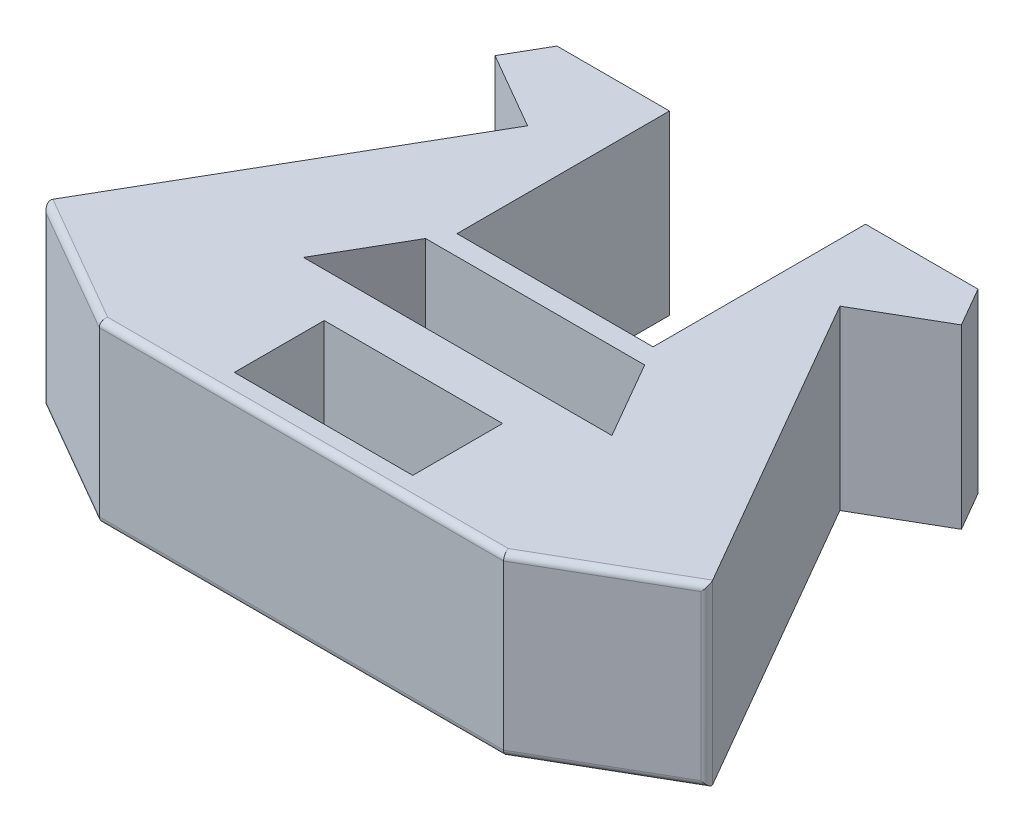
ISO-10303-21;
HEADER;
FILE_DESCRIPTION(('STEP AP214'),'2;1');
FILE_NAME('part.step','',(''),(''),'','','');
FILE_SCHEMA(('AUTOMOTIVE_DESIGN { 1 0 10303 214 1 1 1 1 }'));
ENDSEC;
DATA;
#1=APPLICATION_CONTEXT('core data for automotive mechanical design processes');
#2=APPLICATION_PROTOCOL_DEFINITION('international standard','automotive_design',2000,#1);
#3=PRODUCT_CONTEXT('',#1,'mechanical');
#4=PRODUCT('Part','Part','',(#3));
#5=PRODUCT_RELATED_PRODUCT_CATEGORY('part','',(#4));
#6=PRODUCT_DEFINITION_FORMATION('','',#4);
#7=PRODUCT_DEFINITION_CONTEXT('part definition',#1,'design');
#8=PRODUCT_DEFINITION('design','',#6,#7);
#9=PRODUCT_DEFINITION_SHAPE('','',#8);
#10=(LENGTH_UNIT() NAMED_UNIT(*) SI_UNIT(.MILLI.,.METRE.));
#11=(NAMED_UNIT(*) PLANE_ANGLE_UNIT() SI_UNIT($,.RADIAN.));
#12=(NAMED_UNIT(*) SI_UNIT($,.STERADIAN.) SOLID_ANGLE_UNIT());
#13=UNCERTAINTY_MEASURE_WITH_UNIT(LENGTH_MEASURE(1.E-05),#10,'distance_accuracy_value','');
#14=(GEOMETRIC_REPRESENTATION_CONTEXT(3) GLOBAL_UNCERTAINTY_ASSIGNED_CONTEXT((#13)) GLOBAL_UNIT_ASSIGNED_CONTEXT((#10,
#11,#12)) REPRESENTATION_CONTEXT('',''));
#15=CARTESIAN_POINT('',(0.,0.,0.));
#16=DIRECTION('',(0.,0.,1.));
#17=DIRECTION('',(1.,0.,0.));
#18=AXIS2_PLACEMENT_3D('',#15,#16,#17);
#19=CARTESIAN_POINT('',(0.,35.,0.));
#20=DIRECTION('',(0.,-1.,0.));
#21=DIRECTION('',(0.,0.,-1.));
#22=AXIS2_PLACEMENT_3D('',#19,#20,#21);
#23=PLANE('',#22);
#24=DIRECTION('',(0.,0.,-1.));
#25=VECTOR('',#24,1.);
#26=CARTESIAN_POINT('',(20.15,35.,61.0732922036151));
#27=LINE('',#26,#25);
#28=CARTESIAN_POINT('',(20.15,35.,81.3732922036151));
#29=VERTEX_POINT('',#28);
#30=CARTESIAN_POINT('',(20.15,35.,61.0732922036151));
#31=VERTEX_POINT('',#30);
#32=EDGE_CURVE('E289',#29,#31,#27,.T.);
#33=ORIENTED_EDGE('',*,*,#32,.F.);
#34=DIRECTION('',(1.,0.,0.));
#35=VECTOR('',#34,1.);
#36=CARTESIAN_POINT('',(-20.15,35.,81.3732922036151));
#37=LINE('',#36,#35);
#38=CARTESIAN_POINT('',(-20.15,35.,81.3732922036151));
#39=VERTEX_POINT('',#38);
#40=EDGE_CURVE('E297',#39,#29,#37,.T.);
#41=ORIENTED_EDGE('',*,*,#40,.F.);
#42=DIRECTION('',(0.,0.,1.));
#43=VECTOR('',#42,1.);
#44=CARTESIAN_POINT('',(-20.15,35.,61.0732922036151));
#45=LINE('',#44,#43);
#46=CARTESIAN_POINT('',(-20.15,35.,61.0732922036151));
#47=VERTEX_POINT('',#46);
#48=EDGE_CURVE('E294',#47,#39,#45,.T.);
#49=ORIENTED_EDGE('',*,*,#48,.F.);
#50=DIRECTION('',(-1.,0.,0.));
#51=VECTOR('',#50,1.);
#52=CARTESIAN_POINT('',(-20.15,35.,61.0732922036151));
#53=LINE('',#52,#51);
#54=EDGE_CURVE('E291',#31,#47,#53,.T.);
#55=ORIENTED_EDGE('',*,*,#54,.F.);
#56=EDGE_LOOP('',(#33,#41,#49,#55));
#57=FACE_BOUND('',#56,.T.);
#58=DIRECTION('',(1.,0.,0.));
#59=VECTOR('',#58,1.);
#60=CARTESIAN_POINT('',(0.,35.,84.8732922036146));
#61=LINE('',#60,#59);
#62=CARTESIAN_POINT('',(-45.2717227504689,35.,84.8732922036146));
#63=VERTEX_POINT('',#62);
#64=CARTESIAN_POINT('',(45.271722750469,35.,84.8732922036146));
#65=VERTEX_POINT('',#64);
#66=EDGE_CURVE('E383',#63,#65,#61,.T.);
#67=ORIENTED_EDGE('',*,*,#66,.T.);
#68=DIRECTION('',(0.866025403784438,0.,-0.500000000000001));
#69=VECTOR('',#68,1.);
#70=CARTESIAN_POINT('',(48.0691442631923,35.,83.2582001402069));
#71=LINE('',#70,#69);
#72=CARTESIAN_POINT('',(74.5265770527685,35.,67.9829941970787));
#73=VERTEX_POINT('',#72);
#74=EDGE_CURVE('E385',#65,#73,#71,.T.);
#75=ORIENTED_EDGE('',*,*,#74,.T.);
#76=DIRECTION('',(-0.500000000000002,0.,-0.866025403784438));
#77=VECTOR('',#76,1.);
#78=CARTESIAN_POINT('',(35.2765770527682,35.,0.));
#79=LINE('',#78,#77);
#80=CARTESIAN_POINT('',(35.2765770527682,35.,0.));
#81=VERTEX_POINT('',#80);
#82=EDGE_CURVE('E326',#73,#81,#79,.T.);
#83=ORIENTED_EDGE('',*,*,#82,.T.);
#84=DIRECTION('',(0.866025403784437,0.,-0.500000000000002));
#85=VECTOR('',#84,1.);
#86=CARTESIAN_POINT('',(52.6836876688354,35.,-10.05));
#87=LINE('',#86,#85);
#88=CARTESIAN_POINT('',(52.6836876688354,35.,-10.05));
#89=VERTEX_POINT('',#88);
#90=EDGE_CURVE('E328',#81,#89,#87,.T.);
#91=ORIENTED_EDGE('',*,*,#90,.T.);
#92=DIRECTION('',(-0.500000000000002,0.,-0.866025403784437));
#93=VECTOR('',#92,1.);
#94=CARTESIAN_POINT('',(47.5587180330747,35.,-18.9267077963853));
#95=LINE('',#94,#93);
#96=CARTESIAN_POINT('',(47.5587180330747,35.,-18.9267077963853));
#97=VERTEX_POINT('',#96);
#98=EDGE_CURVE('E330',#89,#97,#95,.T.);
#99=ORIENTED_EDGE('',*,*,#98,.T.);
#100=DIRECTION('',(-1.,0.,0.));
#101=VECTOR('',#100,1.);
#102=CARTESIAN_POINT('',(22.15,35.,-18.9267077963853));
#103=LINE('',#102,#101);
#104=CARTESIAN_POINT('',(22.15,35.,-18.9267077963853));
#105=VERTEX_POINT('',#104);
#106=EDGE_CURVE('E332',#97,#105,#103,.T.);
#107=ORIENTED_EDGE('',*,*,#106,.T.);
#108=DIRECTION('',(0.,0.,1.));
#109=VECTOR('',#108,1.);
#110=CARTESIAN_POINT('',(22.15,35.,29.0732922036148));
#111=LINE('',#110,#109);
#112=CARTESIAN_POINT('',(22.15,35.,29.0732922036148));
#113=VERTEX_POINT('',#112);
#114=EDGE_CURVE('E213',#105,#113,#111,.T.);
#115=ORIENTED_EDGE('',*,*,#114,.T.);
#116=DIRECTION('',(-1.,0.,0.));
#117=VECTOR('',#116,1.);
#118=CARTESIAN_POINT('',(-22.15,35.,29.0732922036148));
#119=LINE('',#118,#117);
#120=CARTESIAN_POINT('',(-22.15,35.,29.0732922036148));
#121=VERTEX_POINT('',#120);
#122=EDGE_CURVE('E335',#113,#121,#119,.T.);
#123=ORIENTED_EDGE('',*,*,#122,.T.);
#124=DIRECTION('',(0.,0.,-1.));
#125=VECTOR('',#124,1.);
#126=CARTESIAN_POINT('',(-22.15,35.,-18.9267077963852));
#127=LINE('',#126,#125);
#128=CARTESIAN_POINT('',(-22.15,35.,-18.9267077963852));
#129=VERTEX_POINT('',#128);
#130=EDGE_CURVE('E337',#121,#129,#127,.T.);
#131=ORIENTED_EDGE('',*,*,#130,.T.);
#132=DIRECTION('',(-1.,0.,0.));
#133=VECTOR('',#132,1.);
#134=CARTESIAN_POINT('',(-47.5587180330747,35.,-18.9267077963852));
#135=LINE('',#134,#133);
#136=CARTESIAN_POINT('',(-47.5587180330747,35.,-18.9267077963852));
#137=VERTEX_POINT('',#136);
#138=EDGE_CURVE('E339',#129,#137,#135,.T.);
#139=ORIENTED_EDGE('',*,*,#138,.T.);
#140=DIRECTION('',(-0.500000000000001,0.,0.866025403784438));
#141=VECTOR('',#140,1.);
#142=CARTESIAN_POINT('',(-52.6836876688354,35.,-10.05));
#143=LINE('',#142,#141);
#144=CARTESIAN_POINT('',(-52.6836876688354,35.,-10.05));
#145=VERTEX_POINT('',#144);
#146=EDGE_CURVE('E318',#137,#145,#143,.T.);
#147=ORIENTED_EDGE('',*,*,#146,.T.);
#148=DIRECTION('',(0.866025403784438,0.,0.500000000000001));
#149=VECTOR('',#148,1.);
#150=CARTESIAN_POINT('',(-52.6836876688354,35.,-10.05));
#151=LINE('',#150,#149);
#152=CARTESIAN_POINT('',(-35.2765770527682,35.,0.));
#153=VERTEX_POINT('',#152);
#154=EDGE_CURVE('E321',#145,#153,#151,.T.);
#155=ORIENTED_EDGE('',*,*,#154,.T.);
#156=DIRECTION('',(-0.500000000000002,0.,0.866025403784438));
#157=VECTOR('',#156,1.);
#158=CARTESIAN_POINT('',(-35.2765770527682,35.,0.));
#159=LINE('',#158,#157);
#160=CARTESIAN_POINT('',(-74.5265770527685,35.,67.9829941970786));
#161=VERTEX_POINT('',#160);
#162=EDGE_CURVE('E323',#153,#161,#159,.T.);
#163=ORIENTED_EDGE('',*,*,#162,.T.);
#164=DIRECTION('',(0.866025403784438,0.,0.500000000000002));
#165=VECTOR('',#164,1.);
#166=CARTESIAN_POINT('',(-48.0691442631924,35.,83.2582001402069));
#167=LINE('',#166,#165);
#168=EDGE_CURVE('E381',#161,#63,#167,.T.);
#169=ORIENTED_EDGE('',*,*,#168,.T.);
#170=EDGE_LOOP('',(#67,#75,#83,#91,#99,#107,#115,#123,#131,#139,#147,#155,#163,#169));
#171=FACE_BOUND('',#170,.T.);
#172=DIRECTION('',(-1.,0.,0.));
#173=VECTOR('',#172,1.);
#174=CARTESIAN_POINT('',(24.7480762113533,35.,33.5732922036148));
#175=LINE('',#174,#173);
#176=CARTESIAN_POINT('',(24.7480762113533,35.,33.5732922036148));
#177=VERTEX_POINT('',#176);
#178=CARTESIAN_POINT('',(-24.7480762113533,35.,33.5732922036148));
#179=VERTEX_POINT('',#178);
#180=EDGE_CURVE('E259',#177,#179,#175,.T.);
#181=ORIENTED_EDGE('',*,*,#180,.F.);
#182=DIRECTION('',(-0.500000000000002,0.,-0.866025403784437));
#183=VECTOR('',#182,1.);
#184=CARTESIAN_POINT('',(34.8517059221718,35.,51.0732922036148));
#185=LINE('',#184,#183);
#186=CARTESIAN_POINT('',(34.8517059221719,35.,51.0732922036148));
#187=VERTEX_POINT('',#186);
#188=EDGE_CURVE('E267',#187,#177,#185,.T.);
#189=ORIENTED_EDGE('',*,*,#188,.F.);
#190=DIRECTION('',(1.,0.,0.));
#191=VECTOR('',#190,1.);
#192=CARTESIAN_POINT('',(-34.8517059221718,35.,51.0732922036148));
#193=LINE('',#192,#191);
#194=CARTESIAN_POINT('',(-34.8517059221718,35.,51.0732922036148));
#195=VERTEX_POINT('',#194);
#196=EDGE_CURVE('E264',#195,#187,#193,.T.);
#197=ORIENTED_EDGE('',*,*,#196,.F.);
#198=DIRECTION('',(-0.500000000000002,0.,0.866025403784437));
#199=VECTOR('',#198,1.);
#200=CARTESIAN_POINT('',(-24.7480762113533,35.,33.5732922036148));
#201=LINE('',#200,#199);
#202=EDGE_CURVE('E261',#179,#195,#201,.T.);
#203=ORIENTED_EDGE('',*,*,#202,.F.);
#204=EDGE_LOOP('',(#181,#189,#197,#203));
#205=FACE_BOUND('',#204,.T.);
#206=ADVANCED_FACE('F35',(#57,#171,#205),#23,.F.);
#207=CARTESIAN_POINT('',(-52.6836876688354,35.,-10.05));
#208=DIRECTION('',(0.866025403784438,0.,0.5));
#209=DIRECTION('',(0.500000000000001,0.,-0.866025403784438));
#210=AXIS2_PLACEMENT_3D('',#207,#208,#209);
#211=PLANE('',#210);
#212=DIRECTION('',(0.,-1.,0.));
#213=VECTOR('',#212,1.);
#214=CARTESIAN_POINT('',(-47.5587180330747,35.,-18.9267077963852));
#215=LINE('',#214,#213);
#216=CARTESIAN_POINT('',(-47.5587180330747,-5.,-18.9267077963852));
#217=VERTEX_POINT('',#216);
#218=EDGE_CURVE('E341',#137,#217,#215,.T.);
#219=ORIENTED_EDGE('',*,*,#218,.T.);
#220=DIRECTION('',(0.500000000000001,0.,-0.866025403784438));
#221=VECTOR('',#220,1.);
#222=CARTESIAN_POINT('',(-43.8645434056433,-5.,-25.3252059431282));
#223=LINE('',#222,#221);
#224=CARTESIAN_POINT('',(-52.6836876688354,-5.,-10.05));
#225=VERTEX_POINT('',#224);
#226=EDGE_CURVE('E242',#225,#217,#223,.T.);
#227=ORIENTED_EDGE('',*,*,#226,.F.);
#228=DIRECTION('',(0.,-1.,0.));
#229=VECTOR('',#228,1.);
#230=CARTESIAN_POINT('',(-52.6836876688354,35.,-10.05));
#231=LINE('',#230,#229);
#232=EDGE_CURVE('E361',#145,#225,#231,.T.);
#233=ORIENTED_EDGE('',*,*,#232,.F.);
#234=ORIENTED_EDGE('',*,*,#146,.F.);
#235=EDGE_LOOP('',(#219,#227,#233,#234));
#236=FACE_BOUND('',#235,.T.);
#237=ADVANCED_FACE('F501',(#236),#211,.F.);
#238=CARTESIAN_POINT('',(-52.6836876688354,35.,-10.05));
#239=DIRECTION('',(0.500000000000001,0.,-0.866025403784438));
#240=DIRECTION('',(-0.866025403784438,0.,-0.500000000000001));
#241=AXIS2_PLACEMENT_3D('',#238,#239,#240);
#242=PLANE('',#241);
#243=ORIENTED_EDGE('',*,*,#232,.T.);
#244=DIRECTION('',(0.866025403784438,0.,0.500000000000001));
#245=VECTOR('',#244,1.);
#246=CARTESIAN_POINT('',(-8.81914426319208,-5.,15.2752059431282));
#247=LINE('',#246,#245);
#248=CARTESIAN_POINT('',(-35.2765770527682,-5.,0.));
#249=VERTEX_POINT('',#248);
#250=EDGE_CURVE('E245',#225,#249,#247,.T.);
#251=ORIENTED_EDGE('',*,*,#250,.T.);
#252=DIRECTION('',(0.,-1.,0.));
#253=VECTOR('',#252,1.);
#254=CARTESIAN_POINT('',(-35.2765770527682,35.,0.));
#255=LINE('',#254,#253);
#256=EDGE_CURVE('E359',#153,#249,#255,.T.);
#257=ORIENTED_EDGE('',*,*,#256,.F.);
#258=ORIENTED_EDGE('',*,*,#154,.F.);
#259=EDGE_LOOP('',(#243,#251,#257,#258));
#260=FACE_BOUND('',#259,.T.);
#261=ADVANCED_FACE('F430',(#260),#242,.F.);
#262=CARTESIAN_POINT('',(-35.2765770527682,35.,0.));
#263=DIRECTION('',(0.866025403784438,0.,0.500000000000002));
#264=DIRECTION('',(0.500000000000002,0.,-0.866025403784438));
#265=AXIS2_PLACEMENT_3D('',#262,#263,#264);
#266=PLANE('',#265);
#267=DIRECTION('',(-0.500000000000002,0.,0.866025403784438));
#268=VECTOR('',#267,1.);
#269=CARTESIAN_POINT('',(-26.4574327895761,-5.,-15.2752059431283));
#270=LINE('',#269,#268);
#271=CARTESIAN_POINT('',(-74.5265770527685,-5.,67.9829941970786));
#272=VERTEX_POINT('',#271);
#273=EDGE_CURVE('E248',#249,#272,#270,.T.);
#274=ORIENTED_EDGE('',*,*,#273,.T.);
#275=DIRECTION('',(0.,-1.,0.));
#276=VECTOR('',#275,1.);
#277=CARTESIAN_POINT('',(-74.5265770527685,35.,67.9829941970786));
#278=LINE('',#277,#276);
#279=EDGE_CURVE('E379',#272,#161,#278,.F.);
#280=ORIENTED_EDGE('',*,*,#279,.T.);
#281=ORIENTED_EDGE('',*,*,#162,.F.);
#282=ORIENTED_EDGE('',*,*,#256,.T.);
#283=EDGE_LOOP('',(#274,#280,#281,#282));
#284=FACE_BOUND('',#283,.T.);
#285=ADVANCED_FACE('F421',(#284),#266,.F.);
#286=CARTESIAN_POINT('',(-75.2765770527685,35.,69.2820323027553));
#287=DIRECTION('',(0.500000000000002,0.,-0.866025403784438));
#288=DIRECTION('',(-0.866025403784438,0.,-0.500000000000002));
#289=AXIS2_PLACEMENT_3D('',#286,#287,#288);
#290=PLANE('',#289);
#291=DIRECTION('',(0.,-1.,0.));
#292=VECTOR('',#291,1.);
#293=CARTESIAN_POINT('',(-73.9775389470918,35.,70.0320323027553));
#294=LINE('',#293,#292);
#295=CARTESIAN_POINT('',(-73.9775389470918,33.5,70.0320323027553));
#296=VERTEX_POINT('',#295);
#297=CARTESIAN_POINT('',(-73.9775389470918,-3.5,70.0320323027553));
#298=VERTEX_POINT('',#297);
#299=EDGE_CURVE('E375',#296,#298,#294,.T.);
#300=ORIENTED_EDGE('',*,*,#299,.T.);
#301=DIRECTION('',(0.866025403784438,0.,0.500000000000002));
#302=VECTOR('',#301,1.);
#303=CARTESIAN_POINT('',(-75.2765770527685,-3.5,69.2820323027553));
#304=LINE('',#303,#302);
#305=CARTESIAN_POINT('',(-45.6736465391156,-3.5,86.3732922036146));
#306=VERTEX_POINT('',#305);
#307=EDGE_CURVE('E377',#298,#306,#304,.T.);
#308=ORIENTED_EDGE('',*,*,#307,.T.);
#309=DIRECTION('',(0.,-1.,0.));
#310=VECTOR('',#309,1.);
#311=CARTESIAN_POINT('',(-45.6736465391156,35.,86.3732922036146));
#312=LINE('',#311,#310);
#313=CARTESIAN_POINT('',(-45.6736465391156,33.5,86.3732922036146));
#314=VERTEX_POINT('',#313);
#315=EDGE_CURVE('E356',#314,#306,#312,.T.);
#316=ORIENTED_EDGE('',*,*,#315,.F.);
#317=DIRECTION('',(0.866025403784438,0.,0.500000000000002));
#318=VECTOR('',#317,1.);
#319=CARTESIAN_POINT('',(-75.2765770527685,33.5,69.2820323027553));
#320=LINE('',#319,#318);
#321=EDGE_CURVE('E373',#314,#296,#320,.F.);
#322=ORIENTED_EDGE('',*,*,#321,.T.);
#323=EDGE_LOOP('',(#300,#308,#316,#322));
#324=FACE_BOUND('',#323,.T.);
#325=ADVANCED_FACE('F491',(#324),#290,.F.);
#326=CARTESIAN_POINT('',(-45.6736465391156,35.,86.3732922036146));
#327=DIRECTION('',(0.,0.,-1.));
#328=DIRECTION('',(-1.,0.,0.));
#329=AXIS2_PLACEMENT_3D('',#326,#327,#328);
#330=PLANE('',#329);
#331=DIRECTION('',(0.,-1.,0.));
#332=VECTOR('',#331,1.);
#333=CARTESIAN_POINT('',(45.6736465391156,35.,86.3732922036146));
#334=LINE('',#333,#332);
#335=CARTESIAN_POINT('',(45.6736465391156,33.5,86.3732922036146));
#336=VERTEX_POINT('',#335);
#337=CARTESIAN_POINT('',(45.6736465391156,-3.5,86.3732922036146));
#338=VERTEX_POINT('',#337);
#339=EDGE_CURVE('E353',#336,#338,#334,.T.);
#340=ORIENTED_EDGE('',*,*,#339,.F.);
#341=DIRECTION('',(1.,0.,0.));
#342=VECTOR('',#341,1.);
#343=CARTESIAN_POINT('',(-45.6736465391156,33.5,86.3732922036146));
#344=LINE('',#343,#342);
#345=EDGE_CURVE('E389',#336,#314,#344,.F.);
#346=ORIENTED_EDGE('',*,*,#345,.T.);
#347=ORIENTED_EDGE('',*,*,#315,.T.);
#348=DIRECTION('',(1.,0.,0.));
#349=VECTOR('',#348,1.);
#350=CARTESIAN_POINT('',(-45.6736465391156,-3.5,86.3732922036146));
#351=LINE('',#350,#349);
#352=EDGE_CURVE('E387',#306,#338,#351,.T.);
#353=ORIENTED_EDGE('',*,*,#352,.T.);
#354=EDGE_LOOP('',(#340,#346,#347,#353));
#355=FACE_BOUND('',#354,.T.);
#356=ADVANCED_FACE('F477',(#355),#330,.F.);
#357=CARTESIAN_POINT('',(45.6736465391156,35.,86.3732922036146));
#358=DIRECTION('',(-0.500000000000001,0.,-0.866025403784438));
#359=DIRECTION('',(-0.866025403784438,0.,0.500000000000001));
#360=AXIS2_PLACEMENT_3D('',#357,#358,#359);
#361=PLANE('',#360);
#362=ORIENTED_EDGE('',*,*,#339,.T.);
#363=DIRECTION('',(0.866025403784438,0.,-0.500000000000001));
#364=VECTOR('',#363,1.);
#365=CARTESIAN_POINT('',(45.6736465391156,-3.5,86.3732922036146));
#366=LINE('',#365,#364);
#367=CARTESIAN_POINT('',(73.9775389470918,-3.5,70.0320323027553));
#368=VERTEX_POINT('',#367);
#369=EDGE_CURVE('E371',#338,#368,#366,.T.);
#370=ORIENTED_EDGE('',*,*,#369,.T.);
#371=DIRECTION('',(0.,-1.,0.));
#372=VECTOR('',#371,1.);
#373=CARTESIAN_POINT('',(73.9775389470918,35.,70.0320323027553));
#374=LINE('',#373,#372);
#375=CARTESIAN_POINT('',(73.9775389470918,33.5,70.0320323027553));
#376=VERTEX_POINT('',#375);
#377=EDGE_CURVE('E368',#368,#376,#374,.F.);
#378=ORIENTED_EDGE('',*,*,#377,.T.);
#379=DIRECTION('',(0.866025403784438,0.,-0.500000000000001));
#380=VECTOR('',#379,1.);
#381=CARTESIAN_POINT('',(45.6736465391156,33.5,86.3732922036146));
#382=LINE('',#381,#380);
#383=EDGE_CURVE('E366',#376,#336,#382,.F.);
#384=ORIENTED_EDGE('',*,*,#383,.T.);
#385=EDGE_LOOP('',(#362,#370,#378,#384));
#386=FACE_BOUND('',#385,.T.);
#387=ADVANCED_FACE('F481',(#386),#361,.F.);
#388=CARTESIAN_POINT('',(35.2765770527682,35.,0.));
#389=DIRECTION('',(-0.866025403784438,0.,0.500000000000002));
#390=DIRECTION('',(0.500000000000002,0.,0.866025403784438));
#391=AXIS2_PLACEMENT_3D('',#388,#389,#390);
#392=PLANE('',#391);
#393=ORIENTED_EDGE('',*,*,#82,.F.);
#394=DIRECTION('',(0.,-1.,0.));
#395=VECTOR('',#394,1.);
#396=CARTESIAN_POINT('',(74.5265770527685,35.,67.9829941970786));
#397=LINE('',#396,#395);
#398=CARTESIAN_POINT('',(74.5265770527685,-5.,67.9829941970786));
#399=VERTEX_POINT('',#398);
#400=EDGE_CURVE('E363',#73,#399,#397,.T.);
#401=ORIENTED_EDGE('',*,*,#400,.T.);
#402=DIRECTION('',(0.500000000000002,0.,0.866025403784438));
#403=VECTOR('',#402,1.);
#404=CARTESIAN_POINT('',(26.4574327895761,-5.,-15.2752059431283));
#405=LINE('',#404,#403);
#406=CARTESIAN_POINT('',(35.2765770527682,-5.,0.));
#407=VERTEX_POINT('',#406);
#408=EDGE_CURVE('E251',#407,#399,#405,.T.);
#409=ORIENTED_EDGE('',*,*,#408,.F.);
#410=DIRECTION('',(0.,-1.,0.));
#411=VECTOR('',#410,1.);
#412=CARTESIAN_POINT('',(35.2765770527682,35.,0.));
#413=LINE('',#412,#411);
#414=EDGE_CURVE('E351',#81,#407,#413,.T.);
#415=ORIENTED_EDGE('',*,*,#414,.F.);
#416=EDGE_LOOP('',(#393,#401,#409,#415));
#417=FACE_BOUND('',#416,.T.);
#418=ADVANCED_FACE('F460',(#417),#392,.F.);
#419=CARTESIAN_POINT('',(52.6836876688354,35.,-10.05));
#420=DIRECTION('',(-0.500000000000002,0.,-0.866025403784438));
#421=DIRECTION('',(-0.866025403784438,0.,0.500000000000002));
#422=AXIS2_PLACEMENT_3D('',#419,#420,#421);
#423=PLANE('',#422);
#424=ORIENTED_EDGE('',*,*,#414,.T.);
#425=DIRECTION('',(-0.866025403784438,0.,0.500000000000002));
#426=VECTOR('',#425,1.);
#427=CARTESIAN_POINT('',(8.81914426319211,-5.,15.2752059431283));
#428=LINE('',#427,#426);
#429=CARTESIAN_POINT('',(52.6836876688354,-5.,-10.05));
#430=VERTEX_POINT('',#429);
#431=EDGE_CURVE('E253',#430,#407,#428,.T.);
#432=ORIENTED_EDGE('',*,*,#431,.F.);
#433=DIRECTION('',(0.,-1.,0.));
#434=VECTOR('',#433,1.);
#435=CARTESIAN_POINT('',(52.6836876688354,35.,-10.05));
#436=LINE('',#435,#434);
#437=EDGE_CURVE('E349',#89,#430,#436,.T.);
#438=ORIENTED_EDGE('',*,*,#437,.F.);
#439=ORIENTED_EDGE('',*,*,#90,.F.);
#440=EDGE_LOOP('',(#424,#432,#438,#439));
#441=FACE_BOUND('',#440,.T.);
#442=ADVANCED_FACE('F456',(#441),#423,.F.);
#443=CARTESIAN_POINT('',(47.5587180330747,35.,-18.9267077963853));
#444=DIRECTION('',(-0.866025403784437,0.,0.500000000000002));
#445=DIRECTION('',(0.500000000000002,0.,0.866025403784437));
#446=AXIS2_PLACEMENT_3D('',#443,#444,#445);
#447=PLANE('',#446);
#448=ORIENTED_EDGE('',*,*,#437,.T.);
#449=DIRECTION('',(0.500000000000002,0.,0.866025403784437));
#450=VECTOR('',#449,1.);
#451=CARTESIAN_POINT('',(43.8645434056433,-5.,-25.3252059431283));
#452=LINE('',#451,#450);
#453=CARTESIAN_POINT('',(47.5587180330747,-5.,-18.9267077963853));
#454=VERTEX_POINT('',#453);
#455=EDGE_CURVE('E256',#454,#430,#452,.T.);
#456=ORIENTED_EDGE('',*,*,#455,.F.);
#457=DIRECTION('',(0.,-1.,0.));
#458=VECTOR('',#457,1.);
#459=CARTESIAN_POINT('',(47.5587180330747,35.,-18.9267077963853));
#460=LINE('',#459,#458);
#461=EDGE_CURVE('E217',#97,#454,#460,.T.);
#462=ORIENTED_EDGE('',*,*,#461,.F.);
#463=ORIENTED_EDGE('',*,*,#98,.F.);
#464=EDGE_LOOP('',(#448,#456,#462,#463));
#465=FACE_BOUND('',#464,.T.);
#466=ADVANCED_FACE('F452',(#465),#447,.F.);
#467=CARTESIAN_POINT('',(22.15,35.,-18.9267077963853));
#468=DIRECTION('',(0.,0.,1.));
#469=DIRECTION('',(1.,0.,0.));
#470=AXIS2_PLACEMENT_3D('',#467,#468,#469);
#471=PLANE('',#470);
#472=ORIENTED_EDGE('',*,*,#461,.T.);
#473=DIRECTION('',(1.,0.,0.));
#474=VECTOR('',#473,1.);
#475=CARTESIAN_POINT('',(0.,-5.,-18.9267077963853));
#476=LINE('',#475,#474);
#477=CARTESIAN_POINT('',(22.15,-5.,-18.9267077963853));
#478=VERTEX_POINT('',#477);
#479=EDGE_CURVE('E224',#478,#454,#476,.T.);
#480=ORIENTED_EDGE('',*,*,#479,.F.);
#481=DIRECTION('',(0.,-1.,0.));
#482=VECTOR('',#481,1.);
#483=CARTESIAN_POINT('',(22.15,35.,-18.9267077963853));
#484=LINE('',#483,#482);
#485=EDGE_CURVE('E208',#105,#478,#484,.T.);
#486=ORIENTED_EDGE('',*,*,#485,.F.);
#487=ORIENTED_EDGE('',*,*,#106,.F.);
#488=EDGE_LOOP('',(#472,#480,#486,#487));
#489=FACE_BOUND('',#488,.T.);
#490=ADVANCED_FACE('F229',(#489),#471,.F.);
#491=CARTESIAN_POINT('',(22.15,35.,29.0732922036148));
#492=DIRECTION('',(1.,0.,0.));
#493=DIRECTION('',(0.,0.,-1.));
#494=AXIS2_PLACEMENT_3D('',#491,#492,#493);
#495=PLANE('',#494);
#496=ORIENTED_EDGE('',*,*,#485,.T.);
#497=DIRECTION('',(0.,0.,-1.));
#498=VECTOR('',#497,1.);
#499=CARTESIAN_POINT('',(22.15,-5.,0.));
#500=LINE('',#499,#498);
#501=CARTESIAN_POINT('',(22.15,-5.,29.0732922036148));
#502=VERTEX_POINT('',#501);
#503=EDGE_CURVE('E212',#502,#478,#500,.T.);
#504=ORIENTED_EDGE('',*,*,#503,.F.);
#505=DIRECTION('',(0.,-1.,0.));
#506=VECTOR('',#505,1.);
#507=CARTESIAN_POINT('',(22.15,35.,29.0732922036148));
#508=LINE('',#507,#506);
#509=EDGE_CURVE('E218',#113,#502,#508,.T.);
#510=ORIENTED_EDGE('',*,*,#509,.F.);
#511=ORIENTED_EDGE('',*,*,#114,.F.);
#512=EDGE_LOOP('',(#496,#504,#510,#511));
#513=FACE_BOUND('',#512,.T.);
#514=ADVANCED_FACE('F210',(#513),#495,.F.);
#515=CARTESIAN_POINT('',(-22.15,35.,29.0732922036148));
#516=DIRECTION('',(0.,0.,1.));
#517=DIRECTION('',(1.,0.,0.));
#518=AXIS2_PLACEMENT_3D('',#515,#516,#517);
#519=PLANE('',#518);
#520=ORIENTED_EDGE('',*,*,#509,.T.);
#521=DIRECTION('',(1.,0.,0.));
#522=VECTOR('',#521,1.);
#523=CARTESIAN_POINT('',(0.,-5.,29.0732922036148));
#524=LINE('',#523,#522);
#525=CARTESIAN_POINT('',(-22.15,-5.,29.0732922036148));
#526=VERTEX_POINT('',#525);
#527=EDGE_CURVE('E227',#526,#502,#524,.T.);
#528=ORIENTED_EDGE('',*,*,#527,.F.);
#529=DIRECTION('',(0.,-1.,0.));
#530=VECTOR('',#529,1.);
#531=CARTESIAN_POINT('',(-22.15,35.,29.0732922036148));
#532=LINE('',#531,#530);
#533=EDGE_CURVE('E345',#121,#526,#532,.T.);
#534=ORIENTED_EDGE('',*,*,#533,.F.);
#535=ORIENTED_EDGE('',*,*,#122,.F.);
#536=EDGE_LOOP('',(#520,#528,#534,#535));
#537=FACE_BOUND('',#536,.T.);
#538=ADVANCED_FACE('F446',(#537),#519,.F.);
#539=CARTESIAN_POINT('',(-22.15,35.,-18.9267077963852));
#540=DIRECTION('',(-1.,0.,0.));
#541=DIRECTION('',(0.,0.,1.));
#542=AXIS2_PLACEMENT_3D('',#539,#540,#541);
#543=PLANE('',#542);
#544=ORIENTED_EDGE('',*,*,#533,.T.);
#545=DIRECTION('',(0.,0.,1.));
#546=VECTOR('',#545,1.);
#547=CARTESIAN_POINT('',(-22.15,-5.,0.));
#548=LINE('',#547,#546);
#549=CARTESIAN_POINT('',(-22.15,-5.,-18.9267077963852));
#550=VERTEX_POINT('',#549);
#551=EDGE_CURVE('E237',#550,#526,#548,.T.);
#552=ORIENTED_EDGE('',*,*,#551,.F.);
#553=DIRECTION('',(0.,-1.,0.));
#554=VECTOR('',#553,1.);
#555=CARTESIAN_POINT('',(-22.15,35.,-18.9267077963852));
#556=LINE('',#555,#554);
#557=EDGE_CURVE('E343',#129,#550,#556,.T.);
#558=ORIENTED_EDGE('',*,*,#557,.F.);
#559=ORIENTED_EDGE('',*,*,#130,.F.);
#560=EDGE_LOOP('',(#544,#552,#558,#559));
#561=FACE_BOUND('',#560,.T.);
#562=ADVANCED_FACE('F443',(#561),#543,.F.);
#563=CARTESIAN_POINT('',(-47.5587180330747,35.,-18.9267077963852));
#564=DIRECTION('',(0.,0.,1.));
#565=DIRECTION('',(1.,0.,0.));
#566=AXIS2_PLACEMENT_3D('',#563,#564,#565);
#567=PLANE('',#566);
#568=ORIENTED_EDGE('',*,*,#557,.T.);
#569=DIRECTION('',(1.,0.,0.));
#570=VECTOR('',#569,1.);
#571=CARTESIAN_POINT('',(0.,-5.,-18.9267077963852));
#572=LINE('',#571,#570);
#573=EDGE_CURVE('E239',#217,#550,#572,.T.);
#574=ORIENTED_EDGE('',*,*,#573,.F.);
#575=ORIENTED_EDGE('',*,*,#218,.F.);
#576=ORIENTED_EDGE('',*,*,#138,.F.);
#577=EDGE_LOOP('',(#568,#574,#575,#576));
#578=FACE_BOUND('',#577,.T.);
#579=ADVANCED_FACE('F438',(#578),#567,.F.);
#580=CARTESIAN_POINT('',(20.15,35.,61.0732922036151));
#581=DIRECTION('',(-1.,0.,0.));
#582=DIRECTION('',(0.,0.,1.));
#583=AXIS2_PLACEMENT_3D('',#580,#581,#582);
#584=PLANE('',#583);
#585=DIRECTION('',(0.,0.,-1.));
#586=VECTOR('',#585,1.);
#587=CARTESIAN_POINT('',(20.15,0.,61.0732922036151));
#588=LINE('',#587,#586);
#589=CARTESIAN_POINT('',(20.15,0.,81.3732922036151));
#590=VERTEX_POINT('',#589);
#591=CARTESIAN_POINT('',(20.15,0.,61.0732922036151));
#592=VERTEX_POINT('',#591);
#593=EDGE_CURVE('E288',#590,#592,#588,.T.);
#594=ORIENTED_EDGE('',*,*,#593,.F.);
#595=DIRECTION('',(0.,-1.,0.));
#596=VECTOR('',#595,1.);
#597=CARTESIAN_POINT('',(20.15,35.,81.3732922036151));
#598=LINE('',#597,#596);
#599=EDGE_CURVE('E299',#29,#590,#598,.T.);
#600=ORIENTED_EDGE('',*,*,#599,.F.);
#601=ORIENTED_EDGE('',*,*,#32,.T.);
#602=DIRECTION('',(0.,-1.,0.));
#603=VECTOR('',#602,1.);
#604=CARTESIAN_POINT('',(20.15,35.,61.0732922036151));
#605=LINE('',#604,#603);
#606=EDGE_CURVE('E315',#31,#592,#605,.T.);
#607=ORIENTED_EDGE('',*,*,#606,.T.);
#608=EDGE_LOOP('',(#594,#600,#601,#607));
#609=FACE_BOUND('',#608,.T.);
#610=ADVANCED_FACE('F511',(#609),#584,.T.);
#611=CARTESIAN_POINT('',(-20.15,35.,61.0732922036151));
#612=DIRECTION('',(0.,0.,1.));
#613=DIRECTION('',(1.,0.,0.));
#614=AXIS2_PLACEMENT_3D('',#611,#612,#613);
#615=PLANE('',#614);
#616=DIRECTION('',(-1.,0.,0.));
#617=VECTOR('',#616,1.);
#618=CARTESIAN_POINT('',(-20.15,0.,61.0732922036151));
#619=LINE('',#618,#617);
#620=CARTESIAN_POINT('',(-20.15,0.,61.0732922036151));
#621=VERTEX_POINT('',#620);
#622=EDGE_CURVE('E302',#592,#621,#619,.T.);
#623=ORIENTED_EDGE('',*,*,#622,.F.);
#624=ORIENTED_EDGE('',*,*,#606,.F.);
#625=ORIENTED_EDGE('',*,*,#54,.T.);
#626=DIRECTION('',(0.,-1.,0.));
#627=VECTOR('',#626,1.);
#628=CARTESIAN_POINT('',(-20.15,35.,61.0732922036151));
#629=LINE('',#628,#627);
#630=EDGE_CURVE('E313',#47,#621,#629,.T.);
#631=ORIENTED_EDGE('',*,*,#630,.T.);
#632=EDGE_LOOP('',(#623,#624,#625,#631));
#633=FACE_BOUND('',#632,.T.);
#634=ADVANCED_FACE('F724',(#633),#615,.T.);
#635=CARTESIAN_POINT('',(-20.15,35.,61.0732922036151));
#636=DIRECTION('',(1.,0.,0.));
#637=DIRECTION('',(0.,0.,-1.));
#638=AXIS2_PLACEMENT_3D('',#635,#636,#637);
#639=PLANE('',#638);
#640=DIRECTION('',(0.,0.,1.));
#641=VECTOR('',#640,1.);
#642=CARTESIAN_POINT('',(-20.15,0.,61.0732922036151));
#643=LINE('',#642,#641);
#644=CARTESIAN_POINT('',(-20.15,0.,81.3732922036151));
#645=VERTEX_POINT('',#644);
#646=EDGE_CURVE('E305',#621,#645,#643,.T.);
#647=ORIENTED_EDGE('',*,*,#646,.F.);
#648=ORIENTED_EDGE('',*,*,#630,.F.);
#649=ORIENTED_EDGE('',*,*,#48,.T.);
#650=DIRECTION('',(0.,-1.,0.));
#651=VECTOR('',#650,1.);
#652=CARTESIAN_POINT('',(-20.15,35.,81.3732922036151));
#653=LINE('',#652,#651);
#654=EDGE_CURVE('E311',#39,#645,#653,.T.);
#655=ORIENTED_EDGE('',*,*,#654,.T.);
#656=EDGE_LOOP('',(#647,#648,#649,#655));
#657=FACE_BOUND('',#656,.T.);
#658=ADVANCED_FACE('F714',(#657),#639,.T.);
#659=CARTESIAN_POINT('',(-20.15,35.,81.3732922036151));
#660=DIRECTION('',(0.,0.,-1.));
#661=DIRECTION('',(-1.,0.,0.));
#662=AXIS2_PLACEMENT_3D('',#659,#660,#661);
#663=PLANE('',#662);
#664=DIRECTION('',(1.,0.,0.));
#665=VECTOR('',#664,1.);
#666=CARTESIAN_POINT('',(-20.15,0.,81.3732922036151));
#667=LINE('',#666,#665);
#668=EDGE_CURVE('E292',#645,#590,#667,.T.);
#669=ORIENTED_EDGE('',*,*,#668,.F.);
#670=ORIENTED_EDGE('',*,*,#654,.F.);
#671=ORIENTED_EDGE('',*,*,#40,.T.);
#672=ORIENTED_EDGE('',*,*,#599,.T.);
#673=EDGE_LOOP('',(#669,#670,#671,#672));
#674=FACE_BOUND('',#673,.T.);
#675=ADVANCED_FACE('F704',(#674),#663,.T.);
#676=CARTESIAN_POINT('',(24.7480762113533,35.,33.5732922036148));
#677=DIRECTION('',(0.,0.,1.));
#678=DIRECTION('',(1.,0.,0.));
#679=AXIS2_PLACEMENT_3D('',#676,#677,#678);
#680=PLANE('',#679);
#681=DIRECTION('',(-1.,0.,0.));
#682=VECTOR('',#681,1.);
#683=CARTESIAN_POINT('',(24.7480762113533,0.,33.5732922036148));
#684=LINE('',#683,#682);
#685=CARTESIAN_POINT('',(24.7480762113533,0.,33.5732922036148));
#686=VERTEX_POINT('',#685);
#687=CARTESIAN_POINT('',(-24.7480762113533,0.,33.5732922036148));
#688=VERTEX_POINT('',#687);
#689=EDGE_CURVE('E258',#686,#688,#684,.T.);
#690=ORIENTED_EDGE('',*,*,#689,.F.);
#691=DIRECTION('',(0.,-1.,0.));
#692=VECTOR('',#691,1.);
#693=CARTESIAN_POINT('',(24.7480762113533,35.,33.5732922036148));
#694=LINE('',#693,#692);
#695=EDGE_CURVE('E269',#177,#686,#694,.T.);
#696=ORIENTED_EDGE('',*,*,#695,.F.);
#697=ORIENTED_EDGE('',*,*,#180,.T.);
#698=DIRECTION('',(0.,-1.,0.));
#699=VECTOR('',#698,1.);
#700=CARTESIAN_POINT('',(-24.7480762113533,35.,33.5732922036148));
#701=LINE('',#700,#699);
#702=EDGE_CURVE('E285',#179,#688,#701,.T.);
#703=ORIENTED_EDGE('',*,*,#702,.T.);
#704=EDGE_LOOP('',(#690,#696,#697,#703));
#705=FACE_BOUND('',#704,.T.);
#706=ADVANCED_FACE('F694',(#705),#680,.T.);
#707=CARTESIAN_POINT('',(-24.7480762113533,35.,33.5732922036148));
#708=DIRECTION('',(0.866025403784438,0.,0.500000000000002));
#709=DIRECTION('',(0.500000000000002,0.,-0.866025403784438));
#710=AXIS2_PLACEMENT_3D('',#707,#708,#709);
#711=PLANE('',#710);
#712=DIRECTION('',(-0.500000000000002,0.,0.866025403784437));
#713=VECTOR('',#712,1.);
#714=CARTESIAN_POINT('',(-24.7480762113533,0.,33.5732922036148));
#715=LINE('',#714,#713);
#716=CARTESIAN_POINT('',(-34.8517059221718,0.,51.0732922036148));
#717=VERTEX_POINT('',#716);
#718=EDGE_CURVE('E272',#688,#717,#715,.T.);
#719=ORIENTED_EDGE('',*,*,#718,.F.);
#720=ORIENTED_EDGE('',*,*,#702,.F.);
#721=ORIENTED_EDGE('',*,*,#202,.T.);
#722=DIRECTION('',(0.,-1.,0.));
#723=VECTOR('',#722,1.);
#724=CARTESIAN_POINT('',(-34.8517059221718,35.,51.0732922036148));
#725=LINE('',#724,#723);
#726=EDGE_CURVE('E283',#195,#717,#725,.T.);
#727=ORIENTED_EDGE('',*,*,#726,.T.);
#728=EDGE_LOOP('',(#719,#720,#721,#727));
#729=FACE_BOUND('',#728,.T.);
#730=ADVANCED_FACE('F684',(#729),#711,.T.);
#731=CARTESIAN_POINT('',(-34.8517059221718,35.,51.0732922036148));
#732=DIRECTION('',(0.,0.,-1.));
#733=DIRECTION('',(-1.,0.,0.));
#734=AXIS2_PLACEMENT_3D('',#731,#732,#733);
#735=PLANE('',#734);
#736=DIRECTION('',(1.,0.,0.));
#737=VECTOR('',#736,1.);
#738=CARTESIAN_POINT('',(-34.8517059221718,0.,51.0732922036148));
#739=LINE('',#738,#737);
#740=CARTESIAN_POINT('',(34.8517059221718,0.,51.0732922036148));
#741=VERTEX_POINT('',#740);
#742=EDGE_CURVE('E275',#717,#741,#739,.T.);
#743=ORIENTED_EDGE('',*,*,#742,.F.);
#744=ORIENTED_EDGE('',*,*,#726,.F.);
#745=ORIENTED_EDGE('',*,*,#196,.T.);
#746=DIRECTION('',(0.,-1.,0.));
#747=VECTOR('',#746,1.);
#748=CARTESIAN_POINT('',(34.8517059221718,35.,51.0732922036148));
#749=LINE('',#748,#747);
#750=EDGE_CURVE('E281',#187,#741,#749,.T.);
#751=ORIENTED_EDGE('',*,*,#750,.T.);
#752=EDGE_LOOP('',(#743,#744,#745,#751));
#753=FACE_BOUND('',#752,.T.);
#754=ADVANCED_FACE('F673',(#753),#735,.T.);
#755=CARTESIAN_POINT('',(34.8517059221718,35.,51.0732922036148));
#756=DIRECTION('',(-0.866025403784438,0.,0.500000000000002));
#757=DIRECTION('',(0.500000000000002,0.,0.866025403784438));
#758=AXIS2_PLACEMENT_3D('',#755,#756,#757);
#759=PLANE('',#758);
#760=DIRECTION('',(-0.500000000000002,0.,-0.866025403784437));
#761=VECTOR('',#760,1.);
#762=CARTESIAN_POINT('',(34.8517059221718,0.,51.0732922036148));
#763=LINE('',#762,#761);
#764=EDGE_CURVE('E262',#741,#686,#763,.T.);
#765=ORIENTED_EDGE('',*,*,#764,.F.);
#766=ORIENTED_EDGE('',*,*,#750,.F.);
#767=ORIENTED_EDGE('',*,*,#188,.T.);
#768=ORIENTED_EDGE('',*,*,#695,.T.);
#769=EDGE_LOOP('',(#765,#766,#767,#768));
#770=FACE_BOUND('',#769,.T.);
#771=ADVANCED_FACE('F663',(#770),#759,.T.);
#772=CARTESIAN_POINT('',(0.,0.,0.));
#773=DIRECTION('',(0.,1.,0.));
#774=DIRECTION('',(0.,0.,1.));
#775=AXIS2_PLACEMENT_3D('',#772,#773,#774);
#776=PLANE('',#775);
#777=ORIENTED_EDGE('',*,*,#764,.T.);
#778=ORIENTED_EDGE('',*,*,#689,.T.);
#779=ORIENTED_EDGE('',*,*,#718,.T.);
#780=ORIENTED_EDGE('',*,*,#742,.T.);
#781=EDGE_LOOP('',(#777,#778,#779,#780));
#782=FACE_BOUND('',#781,.T.);
#783=ADVANCED_FACE('F652',(#782),#776,.T.);
#784=ORIENTED_EDGE('',*,*,#668,.T.);
#785=ORIENTED_EDGE('',*,*,#593,.T.);
#786=ORIENTED_EDGE('',*,*,#622,.T.);
#787=ORIENTED_EDGE('',*,*,#646,.T.);
#788=EDGE_LOOP('',(#784,#785,#786,#787));
#789=FACE_BOUND('',#788,.T.);
#790=ADVANCED_FACE('F599',(#789),#776,.T.);
#791=CARTESIAN_POINT('',(0.,-5.,0.));
#792=DIRECTION('',(0.,1.,0.));
#793=DIRECTION('',(0.,0.,1.));
#794=AXIS2_PLACEMENT_3D('',#791,#792,#793);
#795=PLANE('',#794);
#796=DIRECTION('',(1.,0.,0.));
#797=VECTOR('',#796,1.);
#798=CARTESIAN_POINT('',(0.,-5.,84.8732922036146));
#799=LINE('',#798,#797);
#800=CARTESIAN_POINT('',(45.2717227504689,-5.,84.8732922036146));
#801=VERTEX_POINT('',#800);
#802=CARTESIAN_POINT('',(-45.2717227504689,-5.,84.8732922036146));
#803=VERTEX_POINT('',#802);
#804=EDGE_CURVE('E44',#801,#803,#799,.F.);
#805=ORIENTED_EDGE('',*,*,#804,.T.);
#806=DIRECTION('',(0.866025403784438,0.,0.500000000000002));
#807=VECTOR('',#806,1.);
#808=CARTESIAN_POINT('',(-48.0691442631924,-5.,83.2582001402069));
#809=LINE('',#808,#807);
#810=EDGE_CURVE('E11',#803,#272,#809,.F.);
#811=ORIENTED_EDGE('',*,*,#810,.T.);
#812=ORIENTED_EDGE('',*,*,#273,.F.);
#813=ORIENTED_EDGE('',*,*,#250,.F.);
#814=ORIENTED_EDGE('',*,*,#226,.T.);
#815=ORIENTED_EDGE('',*,*,#573,.T.);
#816=ORIENTED_EDGE('',*,*,#551,.T.);
#817=ORIENTED_EDGE('',*,*,#527,.T.);
#818=ORIENTED_EDGE('',*,*,#503,.T.);
#819=ORIENTED_EDGE('',*,*,#479,.T.);
#820=ORIENTED_EDGE('',*,*,#455,.T.);
#821=ORIENTED_EDGE('',*,*,#431,.T.);
#822=ORIENTED_EDGE('',*,*,#408,.T.);
#823=DIRECTION('',(0.866025403784438,0.,-0.500000000000001));
#824=VECTOR('',#823,1.);
#825=CARTESIAN_POINT('',(48.0691442631923,-5.,83.2582001402069));
#826=LINE('',#825,#824);
#827=EDGE_CURVE('E55',#399,#801,#826,.F.);
#828=ORIENTED_EDGE('',*,*,#827,.T.);
#829=EDGE_LOOP('',(#805,#811,#812,#813,#814,#815,#816,#817,#818,#819,#820,#821,#822,#828));
#830=FACE_BOUND('',#829,.T.);
#831=ADVANCED_FACE('F222',(#830),#795,.F.);
#832=CARTESIAN_POINT('',(-73.2275389470918,35.,68.7329941970786));
#833=DIRECTION('',(0.,-1.,0.));
#834=DIRECTION('',(0.,0.,-1.));
#835=AXIS2_PLACEMENT_3D('',#832,#833,#834);
#836=CYLINDRICAL_SURFACE('',#835,1.5);
#837=CARTESIAN_POINT('',(-73.2275389470918,-3.5,68.7329941970786));
#838=DIRECTION('',(0.612372435695794,-0.707106781186547,0.353553390593275));
#839=DIRECTION('',(0.612372435695794,0.707106781186547,0.353553390593275));
#840=AXIS2_PLACEMENT_3D('',#837,#838,#839);
#841=ELLIPSE('',#840,2.12132034355964,1.5);
#842=EDGE_CURVE('E234',#298,#272,#841,.T.);
#843=ORIENTED_EDGE('',*,*,#842,.F.);
#844=ORIENTED_EDGE('',*,*,#299,.F.);
#845=CARTESIAN_POINT('',(-73.2275389470918,33.5,68.7329941970786));
#846=DIRECTION('',(0.612372435695794,0.707106781186547,0.353553390593275));
#847=DIRECTION('',(0.612372435695794,-0.707106781186547,0.353553390593275));
#848=AXIS2_PLACEMENT_3D('',#845,#846,#847);
#849=ELLIPSE('',#848,2.12132034355964,1.5);
#850=EDGE_CURVE('E39',#161,#296,#849,.T.);
#851=ORIENTED_EDGE('',*,*,#850,.F.);
#852=ORIENTED_EDGE('',*,*,#279,.F.);
#853=EDGE_LOOP('',(#843,#844,#851,#852));
#854=FACE_BOUND('',#853,.T.);
#855=ADVANCED_FACE('F37',(#854),#836,.T.);
#856=CARTESIAN_POINT('',(-48.0691442631924,33.5,83.2582001402069));
#857=DIRECTION('',(0.866025403784438,0.,0.500000000000002));
#858=DIRECTION('',(0.500000000000002,0.,-0.866025403784438));
#859=AXIS2_PLACEMENT_3D('',#856,#857,#858);
#860=CYLINDRICAL_SURFACE('',#859,1.5);
#861=ORIENTED_EDGE('',*,*,#850,.T.);
#862=ORIENTED_EDGE('',*,*,#321,.F.);
#863=CARTESIAN_POINT('',(-45.2717227504689,33.5,84.8732922036146));
#864=DIRECTION('',(0.965925826289068,0.,0.258819045102522));
#865=DIRECTION('',(-0.258819045102521,0.,0.965925826289068));
#866=AXIS2_PLACEMENT_3D('',#863,#864,#865);
#867=ELLIPSE('',#866,1.55291427061513,1.5);
#868=EDGE_CURVE('E406',#63,#314,#867,.T.);
#869=ORIENTED_EDGE('',*,*,#868,.F.);
#870=ORIENTED_EDGE('',*,*,#168,.F.);
#871=EDGE_LOOP('',(#861,#862,#869,#870));
#872=FACE_BOUND('',#871,.T.);
#873=ADVANCED_FACE('F493',(#872),#860,.T.);
#874=CARTESIAN_POINT('',(-74.5265770527685,-3.5,67.9829941970786));
#875=DIRECTION('',(0.866025403784438,0.,0.500000000000002));
#876=DIRECTION('',(0.500000000000002,0.,-0.866025403784438));
#877=AXIS2_PLACEMENT_3D('',#874,#875,#876);
#878=CYLINDRICAL_SURFACE('',#877,1.5);
#879=ORIENTED_EDGE('',*,*,#842,.T.);
#880=ORIENTED_EDGE('',*,*,#810,.F.);
#881=CARTESIAN_POINT('',(-45.2717227504689,-3.5,84.8732922036146));
#882=DIRECTION('',(0.965925826289068,0.,0.258819045102522));
#883=DIRECTION('',(-0.258819045102521,0.,0.965925826289068));
#884=AXIS2_PLACEMENT_3D('',#881,#882,#883);
#885=ELLIPSE('',#884,1.55291427061513,1.5);
#886=EDGE_CURVE('E403',#306,#803,#885,.T.);
#887=ORIENTED_EDGE('',*,*,#886,.F.);
#888=ORIENTED_EDGE('',*,*,#307,.F.);
#889=EDGE_LOOP('',(#879,#880,#887,#888));
#890=FACE_BOUND('',#889,.T.);
#891=ADVANCED_FACE('F412',(#890),#878,.T.);
#892=CARTESIAN_POINT('',(0.,33.5,84.8732922036146));
#893=DIRECTION('',(1.,0.,0.));
#894=DIRECTION('',(0.,0.,-1.));
#895=AXIS2_PLACEMENT_3D('',#892,#893,#894);
#896=CYLINDRICAL_SURFACE('',#895,1.5);
#897=ORIENTED_EDGE('',*,*,#868,.T.);
#898=ORIENTED_EDGE('',*,*,#345,.F.);
#899=CARTESIAN_POINT('',(45.2717227504689,33.5,84.8732922036146));
#900=DIRECTION('',(0.965925826289068,0.,-0.258819045102521));
#901=DIRECTION('',(-0.258819045102521,0.,-0.965925826289068));
#902=AXIS2_PLACEMENT_3D('',#899,#900,#901);
#903=ELLIPSE('',#902,1.55291427061513,1.5);
#904=EDGE_CURVE('E400',#65,#336,#903,.T.);
#905=ORIENTED_EDGE('',*,*,#904,.F.);
#906=ORIENTED_EDGE('',*,*,#66,.F.);
#907=EDGE_LOOP('',(#897,#898,#905,#906));
#908=FACE_BOUND('',#907,.T.);
#909=ADVANCED_FACE('F488',(#908),#896,.T.);
#910=CARTESIAN_POINT('',(-45.6736465391156,-3.5,84.8732922036146));
#911=DIRECTION('',(1.,0.,0.));
#912=DIRECTION('',(0.,0.,-1.));
#913=AXIS2_PLACEMENT_3D('',#910,#911,#912);
#914=CYLINDRICAL_SURFACE('',#913,1.5);
#915=ORIENTED_EDGE('',*,*,#886,.T.);
#916=ORIENTED_EDGE('',*,*,#804,.F.);
#917=CARTESIAN_POINT('',(45.2717227504689,-3.5,84.8732922036146));
#918=DIRECTION('',(0.965925826289068,0.,-0.258819045102521));
#919=DIRECTION('',(-0.258819045102521,0.,-0.965925826289068));
#920=AXIS2_PLACEMENT_3D('',#917,#918,#919);
#921=ELLIPSE('',#920,1.55291427061513,1.5);
#922=EDGE_CURVE('E397',#338,#801,#921,.T.);
#923=ORIENTED_EDGE('',*,*,#922,.F.);
#924=ORIENTED_EDGE('',*,*,#352,.F.);
#925=EDGE_LOOP('',(#915,#916,#923,#924));
#926=FACE_BOUND('',#925,.T.);
#927=ADVANCED_FACE('F474',(#926),#914,.T.);
#928=CARTESIAN_POINT('',(48.0691442631923,33.5,83.2582001402069));
#929=DIRECTION('',(0.866025403784438,0.,-0.500000000000001));
#930=DIRECTION('',(-0.500000000000001,0.,-0.866025403784438));
#931=AXIS2_PLACEMENT_3D('',#928,#929,#930);
#932=CYLINDRICAL_SURFACE('',#931,1.5);
#933=ORIENTED_EDGE('',*,*,#904,.T.);
#934=ORIENTED_EDGE('',*,*,#383,.F.);
#935=CARTESIAN_POINT('',(73.2275389470919,33.5,68.7329941970786));
#936=DIRECTION('',(0.612372435695794,-0.707106781186547,-0.353553390593275));
#937=DIRECTION('',(0.612372435695794,0.707106781186547,-0.353553390593275));
#938=AXIS2_PLACEMENT_3D('',#935,#936,#937);
#939=ELLIPSE('',#938,2.12132034355964,1.5);
#940=EDGE_CURVE('E395',#73,#376,#939,.T.);
#941=ORIENTED_EDGE('',*,*,#940,.F.);
#942=ORIENTED_EDGE('',*,*,#74,.F.);
#943=EDGE_LOOP('',(#933,#934,#941,#942));
#944=FACE_BOUND('',#943,.T.);
#945=ADVANCED_FACE('F483',(#944),#932,.T.);
#946=CARTESIAN_POINT('',(44.9236465391156,-3.5,85.074254097938));
#947=DIRECTION('',(0.866025403784438,0.,-0.500000000000001));
#948=DIRECTION('',(-0.500000000000001,0.,-0.866025403784438));
#949=AXIS2_PLACEMENT_3D('',#946,#947,#948);
#950=CYLINDRICAL_SURFACE('',#949,1.5);
#951=ORIENTED_EDGE('',*,*,#922,.T.);
#952=ORIENTED_EDGE('',*,*,#827,.F.);
#953=CARTESIAN_POINT('',(73.2275389470918,-3.5,68.7329941970786));
#954=DIRECTION('',(0.612372435695794,0.707106781186547,-0.353553390593275));
#955=DIRECTION('',(0.612372435695794,-0.707106781186547,-0.353553390593275));
#956=AXIS2_PLACEMENT_3D('',#953,#954,#955);
#957=ELLIPSE('',#956,2.12132034355964,1.5);
#958=EDGE_CURVE('E393',#368,#399,#957,.T.);
#959=ORIENTED_EDGE('',*,*,#958,.F.);
#960=ORIENTED_EDGE('',*,*,#369,.F.);
#961=EDGE_LOOP('',(#951,#952,#959,#960));
#962=FACE_BOUND('',#961,.T.);
#963=ADVANCED_FACE('F470',(#962),#950,.T.);
#964=CARTESIAN_POINT('',(73.2275389470918,35.,68.7329941970786));
#965=DIRECTION('',(0.,-1.,0.));
#966=DIRECTION('',(0.,0.,-1.));
#967=AXIS2_PLACEMENT_3D('',#964,#965,#966);
#968=CYLINDRICAL_SURFACE('',#967,1.5);
#969=ORIENTED_EDGE('',*,*,#940,.T.);
#970=ORIENTED_EDGE('',*,*,#377,.F.);
#971=ORIENTED_EDGE('',*,*,#958,.T.);
#972=ORIENTED_EDGE('',*,*,#400,.F.);
#973=EDGE_LOOP('',(#969,#970,#971,#972));
#974=FACE_BOUND('',#973,.T.);
#975=ADVANCED_FACE('F464',(#974),#968,.T.);
#976=CLOSED_SHELL('',(#206,#237,#261,#285,#325,#356,#387,#418,#442,#466,#490,#514,#538,#562,
#579,#610,#634,#658,#675,#706,#730,#754,#771,#783,#790,#831,#855,#873,#891,#909,#927,#945,#963,#975));
#977=MANIFOLD_SOLID_BREP('B2',#976);
#978=ADVANCED_BREP_SHAPE_REPRESENTATION('',(#18,#977),#14);
#979=SHAPE_DEFINITION_REPRESENTATION(#9,#978);
ENDSEC;
END-ISO-10303-21;
